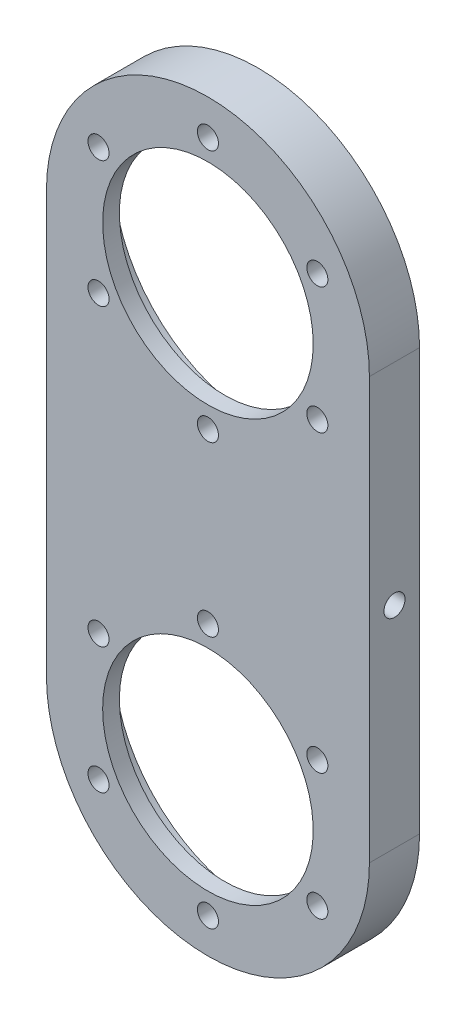
ISO-10303-21;
HEADER;
FILE_DESCRIPTION(('STEP AP214'),'2;1');
FILE_NAME('part.step','',(''),(''),'','','');
FILE_SCHEMA(('AUTOMOTIVE_DESIGN { 1 0 10303 214 1 1 1 1 }'));
ENDSEC;
DATA;
#1=APPLICATION_CONTEXT('core data for automotive mechanical design processes');
#2=APPLICATION_PROTOCOL_DEFINITION('international standard','automotive_design',2000,#1);
#3=PRODUCT_CONTEXT('',#1,'mechanical');
#4=PRODUCT('Part','Part','',(#3));
#5=PRODUCT_RELATED_PRODUCT_CATEGORY('part','',(#4));
#6=PRODUCT_DEFINITION_FORMATION('','',#4);
#7=PRODUCT_DEFINITION_CONTEXT('part definition',#1,'design');
#8=PRODUCT_DEFINITION('design','',#6,#7);
#9=PRODUCT_DEFINITION_SHAPE('','',#8);
#10=(LENGTH_UNIT() NAMED_UNIT(*) SI_UNIT(.MILLI.,.METRE.));
#11=(NAMED_UNIT(*) PLANE_ANGLE_UNIT() SI_UNIT($,.RADIAN.));
#12=(NAMED_UNIT(*) SI_UNIT($,.STERADIAN.) SOLID_ANGLE_UNIT());
#13=UNCERTAINTY_MEASURE_WITH_UNIT(LENGTH_MEASURE(1.E-05),#10,'distance_accuracy_value','');
#14=(GEOMETRIC_REPRESENTATION_CONTEXT(3) GLOBAL_UNCERTAINTY_ASSIGNED_CONTEXT((#13)) GLOBAL_UNIT_ASSIGNED_CONTEXT((#10,
#11,#12)) REPRESENTATION_CONTEXT('',''));
#15=CARTESIAN_POINT('',(0.,0.,0.));
#16=DIRECTION('',(0.,0.,1.));
#17=DIRECTION('',(1.,0.,0.));
#18=AXIS2_PLACEMENT_3D('',#15,#16,#17);
#19=CARTESIAN_POINT('',(0.,-40.,9.525));
#20=DIRECTION('',(0.,0.,-1.));
#21=DIRECTION('',(-1.,0.,0.));
#22=AXIS2_PLACEMENT_3D('',#19,#20,#21);
#23=CYLINDRICAL_SURFACE('',#22,27.5);
#24=CARTESIAN_POINT('',(0.,-40.,0.));
#25=DIRECTION('',(0.,0.,1.));
#26=DIRECTION('',(-1.,0.,0.));
#27=AXIS2_PLACEMENT_3D('',#24,#25,#26);
#28=CIRCLE('',#27,27.5);
#29=CARTESIAN_POINT('',(-27.5,-40.,0.));
#30=VERTEX_POINT('',#29);
#31=EDGE_CURVE('E122',#30,#30,#28,.T.);
#32=CARTESIAN_POINT('',(0.,-40.,6.35));
#33=DIRECTION('',(0.,0.,1.));
#34=DIRECTION('',(1.,0.,0.));
#35=AXIS2_PLACEMENT_3D('',#32,#33,#34);
#36=CIRCLE('',#35,27.5);
#37=CARTESIAN_POINT('',(-27.5,-40.,6.35));
#38=VERTEX_POINT('',#37);
#39=EDGE_CURVE('E137',#38,#38,#36,.T.);
#40=CARTESIAN_POINT('',(-27.5,-40.,0.));
#41=CARTESIAN_POINT('',(-27.5,-40.,0.0661458333333336));
#42=CARTESIAN_POINT('',(-27.5,-40.,0.132291666666667));
#43=CARTESIAN_POINT('',(-27.5,-40.,0.264583333333334));
#44=CARTESIAN_POINT('',(-27.5,-40.,0.330729166666667));
#45=CARTESIAN_POINT('',(-27.5,-40.,0.463020833333333));
#46=CARTESIAN_POINT('',(-27.5,-40.,0.529166666666667));
#47=CARTESIAN_POINT('',(-27.5,-40.,0.661458333333333));
#48=CARTESIAN_POINT('',(-27.5,-40.,0.727604166666666));
#49=CARTESIAN_POINT('',(-27.5,-40.,0.859895833333333));
#50=CARTESIAN_POINT('',(-27.5,-40.,0.926041666666666));
#51=CARTESIAN_POINT('',(-27.5,-40.,1.05833333333333));
#52=CARTESIAN_POINT('',(-27.5,-40.,1.12447916666667));
#53=CARTESIAN_POINT('',(-27.5,-40.,1.25677083333333));
#54=CARTESIAN_POINT('',(-27.5,-40.,1.32291666666667));
#55=CARTESIAN_POINT('',(-27.5,-40.,1.45520833333333));
#56=CARTESIAN_POINT('',(-27.5,-40.,1.52135416666667));
#57=CARTESIAN_POINT('',(-27.5,-40.,1.65364583333333));
#58=CARTESIAN_POINT('',(-27.5,-40.,1.71979166666667));
#59=CARTESIAN_POINT('',(-27.5,-40.,1.85208333333333));
#60=CARTESIAN_POINT('',(-27.5,-40.,1.91822916666667));
#61=CARTESIAN_POINT('',(-27.5,-40.,2.05052083333333));
#62=CARTESIAN_POINT('',(-27.5,-40.,2.11666666666667));
#63=CARTESIAN_POINT('',(-27.5,-40.,2.24895833333333));
#64=CARTESIAN_POINT('',(-27.5,-40.,2.31510416666667));
#65=CARTESIAN_POINT('',(-27.5,-40.,2.44739583333333));
#66=CARTESIAN_POINT('',(-27.5,-40.,2.51354166666667));
#67=CARTESIAN_POINT('',(-27.5,-40.,2.64583333333333));
#68=CARTESIAN_POINT('',(-27.5,-40.,2.71197916666667));
#69=CARTESIAN_POINT('',(-27.5,-40.,2.84427083333333));
#70=CARTESIAN_POINT('',(-27.5,-40.,2.91041666666667));
#71=CARTESIAN_POINT('',(-27.5,-40.,3.04270833333333));
#72=CARTESIAN_POINT('',(-27.5,-40.,3.10885416666667));
#73=CARTESIAN_POINT('',(-27.5,-40.,3.24114583333333));
#74=CARTESIAN_POINT('',(-27.5,-40.,3.30729166666667));
#75=CARTESIAN_POINT('',(-27.5,-40.,3.43958333333333));
#76=CARTESIAN_POINT('',(-27.5,-40.,3.50572916666667));
#77=CARTESIAN_POINT('',(-27.5,-40.,3.63802083333333));
#78=CARTESIAN_POINT('',(-27.5,-40.,3.70416666666667));
#79=CARTESIAN_POINT('',(-27.5,-40.,3.83645833333333));
#80=CARTESIAN_POINT('',(-27.5,-40.,3.90260416666667));
#81=CARTESIAN_POINT('',(-27.5,-40.,4.03489583333333));
#82=CARTESIAN_POINT('',(-27.5,-40.,4.10104166666667));
#83=CARTESIAN_POINT('',(-27.5,-40.,4.23333333333333));
#84=CARTESIAN_POINT('',(-27.5,-40.,4.29947916666667));
#85=CARTESIAN_POINT('',(-27.5,-40.,4.43177083333333));
#86=CARTESIAN_POINT('',(-27.5,-40.,4.49791666666667));
#87=CARTESIAN_POINT('',(-27.5,-40.,4.63020833333333));
#88=CARTESIAN_POINT('',(-27.5,-40.,4.69635416666667));
#89=CARTESIAN_POINT('',(-27.5,-40.,4.82864583333333));
#90=CARTESIAN_POINT('',(-27.5,-40.,4.89479166666667));
#91=CARTESIAN_POINT('',(-27.5,-40.,5.02708333333333));
#92=CARTESIAN_POINT('',(-27.5,-40.,5.09322916666667));
#93=CARTESIAN_POINT('',(-27.5,-40.,5.22552083333333));
#94=CARTESIAN_POINT('',(-27.5,-40.,5.29166666666667));
#95=CARTESIAN_POINT('',(-27.5,-40.,5.42395833333333));
#96=CARTESIAN_POINT('',(-27.5,-40.,5.49010416666667));
#97=CARTESIAN_POINT('',(-27.5,-40.,5.62239583333333));
#98=CARTESIAN_POINT('',(-27.5,-40.,5.68854166666667));
#99=CARTESIAN_POINT('',(-27.5,-40.,5.82083333333333));
#100=CARTESIAN_POINT('',(-27.5,-40.,5.88697916666667));
#101=CARTESIAN_POINT('',(-27.5,-40.,6.01927083333333));
#102=CARTESIAN_POINT('',(-27.5,-40.,6.08541666666667));
#103=CARTESIAN_POINT('',(-27.5,-40.,6.21770833333333));
#104=CARTESIAN_POINT('',(-27.5,-40.,6.28385416666667));
#105=CARTESIAN_POINT('',(-27.5,-40.,6.35));
#106=B_SPLINE_CURVE_WITH_KNOTS('',3,(#40,#41,#42,#43,#44,#45,#46,#47,#48,#49,#50,#51,#52,#53,
#54,#55,#56,#57,#58,#59,#60,#61,#62,#63,#64,#65,#66,#67,#68,#69,#70,#71,#72,#73,#74,#75,#76,#77,
#78,#79,#80,#81,#82,#83,#84,#85,#86,#87,#88,#89,#90,#91,#92,#93,#94,#95,#96,#97,#98,#99,#100,
#101,#102,#103,#104,#105),.UNSPECIFIED.,.F.,.F.,(4,2,2,2,2,2,2,2,2,2,2,2,2,2,2,2,2,2,2,2,2,2,2,
2,2,2,2,2,2,2,2,2,4),(0.,0.198437500000001,0.396875,0.5953125,0.793749999999999,0.9921875,
1.190625,1.3890625,1.5875,1.7859375,1.984375,2.1828125,2.38125,2.5796875,2.778125,2.9765625,
3.175,3.3734375,3.571875,3.7703125,3.96875,4.1671875,4.365625,4.5640625,4.7625,4.9609375,
5.159375,5.3578125,5.55625,5.7546875,5.953125,6.1515625,6.35),.UNSPECIFIED.);
#107=EDGE_CURVE('BSEAM47',#30,#38,#106,.T.);
#108=ORIENTED_EDGE('',*,*,#31,.F.);
#109=ORIENTED_EDGE('',*,*,#39,.T.);
#110=ORIENTED_EDGE('',*,*,#107,.T.);
#111=ORIENTED_EDGE('',*,*,#107,.F.);
#112=EDGE_LOOP('',(#108,#110,#109,#111));
#113=FACE_BOUND('',#112,.T.);
#114=ADVANCED_FACE('F47',(#113),#23,.F.);
#115=CARTESIAN_POINT('',(0.,40.,9.525));
#116=DIRECTION('',(0.,0.,-1.));
#117=DIRECTION('',(-1.,0.,0.));
#118=AXIS2_PLACEMENT_3D('',#115,#116,#117);
#119=CYLINDRICAL_SURFACE('',#118,27.5);
#120=CARTESIAN_POINT('',(0.,40.,0.));
#121=DIRECTION('',(0.,0.,1.));
#122=DIRECTION('',(1.,0.,0.));
#123=AXIS2_PLACEMENT_3D('',#120,#121,#122);
#124=CIRCLE('',#123,27.5);
#125=CARTESIAN_POINT('',(-27.5,40.,0.));
#126=VERTEX_POINT('',#125);
#127=EDGE_CURVE('E144',#126,#126,#124,.T.);
#128=CARTESIAN_POINT('',(0.,40.,6.35));
#129=DIRECTION('',(0.,0.,1.));
#130=DIRECTION('',(1.,0.,0.));
#131=AXIS2_PLACEMENT_3D('',#128,#129,#130);
#132=CIRCLE('',#131,27.5);
#133=CARTESIAN_POINT('',(-27.5,40.,6.35));
#134=VERTEX_POINT('',#133);
#135=EDGE_CURVE('E134',#134,#134,#132,.T.);
#136=CARTESIAN_POINT('',(-27.5,40.,0.));
#137=CARTESIAN_POINT('',(-27.5,40.,0.0661458333333336));
#138=CARTESIAN_POINT('',(-27.5,40.,0.132291666666667));
#139=CARTESIAN_POINT('',(-27.5,40.,0.264583333333334));
#140=CARTESIAN_POINT('',(-27.5,40.,0.330729166666667));
#141=CARTESIAN_POINT('',(-27.5,40.,0.463020833333333));
#142=CARTESIAN_POINT('',(-27.5,40.,0.529166666666667));
#143=CARTESIAN_POINT('',(-27.5,40.,0.661458333333333));
#144=CARTESIAN_POINT('',(-27.5,40.,0.727604166666666));
#145=CARTESIAN_POINT('',(-27.5,40.,0.859895833333333));
#146=CARTESIAN_POINT('',(-27.5,40.,0.926041666666666));
#147=CARTESIAN_POINT('',(-27.5,40.,1.05833333333333));
#148=CARTESIAN_POINT('',(-27.5,40.,1.12447916666667));
#149=CARTESIAN_POINT('',(-27.5,40.,1.25677083333333));
#150=CARTESIAN_POINT('',(-27.5,40.,1.32291666666667));
#151=CARTESIAN_POINT('',(-27.5,40.,1.45520833333333));
#152=CARTESIAN_POINT('',(-27.5,40.,1.52135416666667));
#153=CARTESIAN_POINT('',(-27.5,40.,1.65364583333333));
#154=CARTESIAN_POINT('',(-27.5,40.,1.71979166666667));
#155=CARTESIAN_POINT('',(-27.5,40.,1.85208333333333));
#156=CARTESIAN_POINT('',(-27.5,40.,1.91822916666667));
#157=CARTESIAN_POINT('',(-27.5,40.,2.05052083333333));
#158=CARTESIAN_POINT('',(-27.5,40.,2.11666666666667));
#159=CARTESIAN_POINT('',(-27.5,40.,2.24895833333333));
#160=CARTESIAN_POINT('',(-27.5,40.,2.31510416666667));
#161=CARTESIAN_POINT('',(-27.5,40.,2.44739583333333));
#162=CARTESIAN_POINT('',(-27.5,40.,2.51354166666667));
#163=CARTESIAN_POINT('',(-27.5,40.,2.64583333333333));
#164=CARTESIAN_POINT('',(-27.5,40.,2.71197916666667));
#165=CARTESIAN_POINT('',(-27.5,40.,2.84427083333333));
#166=CARTESIAN_POINT('',(-27.5,40.,2.91041666666667));
#167=CARTESIAN_POINT('',(-27.5,40.,3.04270833333333));
#168=CARTESIAN_POINT('',(-27.5,40.,3.10885416666667));
#169=CARTESIAN_POINT('',(-27.5,40.,3.24114583333333));
#170=CARTESIAN_POINT('',(-27.5,40.,3.30729166666667));
#171=CARTESIAN_POINT('',(-27.5,40.,3.43958333333333));
#172=CARTESIAN_POINT('',(-27.5,40.,3.50572916666667));
#173=CARTESIAN_POINT('',(-27.5,40.,3.63802083333333));
#174=CARTESIAN_POINT('',(-27.5,40.,3.70416666666667));
#175=CARTESIAN_POINT('',(-27.5,40.,3.83645833333333));
#176=CARTESIAN_POINT('',(-27.5,40.,3.90260416666667));
#177=CARTESIAN_POINT('',(-27.5,40.,4.03489583333333));
#178=CARTESIAN_POINT('',(-27.5,40.,4.10104166666667));
#179=CARTESIAN_POINT('',(-27.5,40.,4.23333333333333));
#180=CARTESIAN_POINT('',(-27.5,40.,4.29947916666667));
#181=CARTESIAN_POINT('',(-27.5,40.,4.43177083333333));
#182=CARTESIAN_POINT('',(-27.5,40.,4.49791666666667));
#183=CARTESIAN_POINT('',(-27.5,40.,4.63020833333333));
#184=CARTESIAN_POINT('',(-27.5,40.,4.69635416666667));
#185=CARTESIAN_POINT('',(-27.5,40.,4.82864583333333));
#186=CARTESIAN_POINT('',(-27.5,40.,4.89479166666667));
#187=CARTESIAN_POINT('',(-27.5,40.,5.02708333333333));
#188=CARTESIAN_POINT('',(-27.5,40.,5.09322916666667));
#189=CARTESIAN_POINT('',(-27.5,40.,5.22552083333333));
#190=CARTESIAN_POINT('',(-27.5,40.,5.29166666666667));
#191=CARTESIAN_POINT('',(-27.5,40.,5.42395833333333));
#192=CARTESIAN_POINT('',(-27.5,40.,5.49010416666667));
#193=CARTESIAN_POINT('',(-27.5,40.,5.62239583333333));
#194=CARTESIAN_POINT('',(-27.5,40.,5.68854166666667));
#195=CARTESIAN_POINT('',(-27.5,40.,5.82083333333333));
#196=CARTESIAN_POINT('',(-27.5,40.,5.88697916666667));
#197=CARTESIAN_POINT('',(-27.5,40.,6.01927083333333));
#198=CARTESIAN_POINT('',(-27.5,40.,6.08541666666667));
#199=CARTESIAN_POINT('',(-27.5,40.,6.21770833333333));
#200=CARTESIAN_POINT('',(-27.5,40.,6.28385416666667));
#201=CARTESIAN_POINT('',(-27.5,40.,6.35));
#202=B_SPLINE_CURVE_WITH_KNOTS('',3,(#136,#137,#138,#139,#140,#141,#142,#143,#144,#145,#146,
#147,#148,#149,#150,#151,#152,#153,#154,#155,#156,#157,#158,#159,#160,#161,#162,#163,#164,#165,
#166,#167,#168,#169,#170,#171,#172,#173,#174,#175,#176,#177,#178,#179,#180,#181,#182,#183,#184,
#185,#186,#187,#188,#189,#190,#191,#192,#193,#194,#195,#196,#197,#198,#199,#200,#201),
.UNSPECIFIED.,.F.,.F.,(4,2,2,2,2,2,2,2,2,2,2,2,2,2,2,2,2,2,2,2,2,2,2,2,2,2,2,2,2,2,2,2,4),(0.,
0.198437500000001,0.396875,0.5953125,0.793749999999999,0.9921875,1.190625,1.3890625,1.5875,
1.7859375,1.984375,2.1828125,2.38125,2.5796875,2.778125,2.9765625,3.175,3.3734375,3.571875,
3.7703125,3.96875,4.1671875,4.365625,4.5640625,4.7625,4.9609375,5.159375,5.3578125,5.55625,
5.7546875,5.953125,6.1515625,6.35),.UNSPECIFIED.);
#203=EDGE_CURVE('BSEAM172',#126,#134,#202,.T.);
#204=ORIENTED_EDGE('',*,*,#127,.F.);
#205=ORIENTED_EDGE('',*,*,#135,.T.);
#206=ORIENTED_EDGE('',*,*,#203,.T.);
#207=ORIENTED_EDGE('',*,*,#203,.F.);
#208=EDGE_LOOP('',(#204,#206,#205,#207));
#209=FACE_BOUND('',#208,.T.);
#210=ADVANCED_FACE('F172',(#209),#119,.F.);
#211=CARTESIAN_POINT('',(0.,40.,9.525));
#212=DIRECTION('',(0.,0.,1.));
#213=DIRECTION('',(1.,0.,0.));
#214=AXIS2_PLACEMENT_3D('',#211,#212,#213);
#215=PLANE('',#214);
#216=CARTESIAN_POINT('',(0.,40.,9.525));
#217=DIRECTION('',(0.,0.,1.));
#218=DIRECTION('',(1.,0.,0.));
#219=AXIS2_PLACEMENT_3D('',#216,#217,#218);
#220=CIRCLE('',#219,30.6750002325888);
#221=CARTESIAN_POINT('',(30.6750002325888,40.,9.525));
#222=VERTEX_POINT('',#221);
#223=CARTESIAN_POINT('',(-30.6750002325888,40.,9.525));
#224=VERTEX_POINT('',#223);
#225=EDGE_CURVE('E100',#222,#224,#220,.T.);
#226=ORIENTED_EDGE('',*,*,#225,.T.);
#227=DIRECTION('',(0.,-1.,0.));
#228=VECTOR('',#227,1.);
#229=CARTESIAN_POINT('',(-30.6750002325888,40.,9.525));
#230=LINE('',#229,#228);
#231=CARTESIAN_POINT('',(-30.6750002325888,-40.,9.525));
#232=VERTEX_POINT('',#231);
#233=EDGE_CURVE('E95',#224,#232,#230,.T.);
#234=ORIENTED_EDGE('',*,*,#233,.T.);
#235=CARTESIAN_POINT('',(0.,-40.,9.525));
#236=DIRECTION('',(0.,0.,1.));
#237=DIRECTION('',(1.,0.,0.));
#238=AXIS2_PLACEMENT_3D('',#235,#236,#237);
#239=CIRCLE('',#238,30.6750002325888);
#240=CARTESIAN_POINT('',(30.6750002325888,-40.,9.525));
#241=VERTEX_POINT('',#240);
#242=EDGE_CURVE('E99',#232,#241,#239,.T.);
#243=ORIENTED_EDGE('',*,*,#242,.T.);
#244=DIRECTION('',(0.,1.,0.));
#245=VECTOR('',#244,1.);
#246=CARTESIAN_POINT('',(30.6750002325888,-40.,9.525));
#247=LINE('',#246,#245);
#248=EDGE_CURVE('E67',#241,#222,#247,.T.);
#249=ORIENTED_EDGE('',*,*,#248,.T.);
#250=EDGE_LOOP('',(#226,#234,#243,#249));
#251=FACE_BOUND('',#250,.T.);
#252=CARTESIAN_POINT('',(0.,40.,9.525));
#253=DIRECTION('',(0.,0.,1.));
#254=DIRECTION('',(1.,0.,0.));
#255=AXIS2_PLACEMENT_3D('',#252,#253,#254);
#256=CIRCLE('',#255,20.);
#257=CARTESIAN_POINT('',(20.,40.,9.525));
#258=VERTEX_POINT('',#257);
#259=EDGE_CURVE('E147',#258,#258,#256,.T.);
#260=ORIENTED_EDGE('',*,*,#259,.F.);
#261=EDGE_LOOP('',(#260));
#262=FACE_BOUND('',#261,.T.);
#263=CARTESIAN_POINT('',(0.,64.,9.525));
#264=DIRECTION('',(0.,0.,1.));
#265=DIRECTION('',(1.,0.,0.));
#266=AXIS2_PLACEMENT_3D('',#263,#264,#265);
#267=CIRCLE('',#266,2.00000000000001);
#268=CARTESIAN_POINT('',(2.00000000000001,64.,9.525));
#269=VERTEX_POINT('',#268);
#270=EDGE_CURVE('E156',#269,#269,#267,.T.);
#271=ORIENTED_EDGE('',*,*,#270,.F.);
#272=EDGE_LOOP('',(#271));
#273=FACE_BOUND('',#272,.T.);
#274=CARTESIAN_POINT('',(20.7846096908265,52.,9.525));
#275=DIRECTION('',(0.,0.,1.));
#276=DIRECTION('',(1.,0.,0.));
#277=AXIS2_PLACEMENT_3D('',#274,#275,#276);
#278=CIRCLE('',#277,2.);
#279=CARTESIAN_POINT('',(22.7846096908265,52.,9.525));
#280=VERTEX_POINT('',#279);
#281=EDGE_CURVE('E254',#280,#280,#278,.T.);
#282=ORIENTED_EDGE('',*,*,#281,.F.);
#283=EDGE_LOOP('',(#282));
#284=FACE_BOUND('',#283,.T.);
#285=CARTESIAN_POINT('',(20.7846096908266,28.,9.525));
#286=DIRECTION('',(0.,0.,1.));
#287=DIRECTION('',(1.,0.,0.));
#288=AXIS2_PLACEMENT_3D('',#285,#286,#287);
#289=CIRCLE('',#288,2.);
#290=CARTESIAN_POINT('',(22.7846096908265,28.,9.525));
#291=VERTEX_POINT('',#290);
#292=EDGE_CURVE('E248',#291,#291,#289,.T.);
#293=ORIENTED_EDGE('',*,*,#292,.F.);
#294=EDGE_LOOP('',(#293));
#295=FACE_BOUND('',#294,.T.);
#296=CARTESIAN_POINT('',(0.,16.,9.525));
#297=DIRECTION('',(0.,0.,1.));
#298=DIRECTION('',(1.,0.,0.));
#299=AXIS2_PLACEMENT_3D('',#296,#297,#298);
#300=CIRCLE('',#299,2.);
#301=CARTESIAN_POINT('',(2.00000000000003,16.,9.525));
#302=VERTEX_POINT('',#301);
#303=EDGE_CURVE('E244',#302,#302,#300,.T.);
#304=ORIENTED_EDGE('',*,*,#303,.F.);
#305=EDGE_LOOP('',(#304));
#306=FACE_BOUND('',#305,.T.);
#307=CARTESIAN_POINT('',(-20.7846096908265,28.,9.525));
#308=DIRECTION('',(0.,0.,1.));
#309=DIRECTION('',(1.,0.,0.));
#310=AXIS2_PLACEMENT_3D('',#307,#308,#309);
#311=CIRCLE('',#310,2.00000000000001);
#312=CARTESIAN_POINT('',(-18.7846096908265,28.,9.525));
#313=VERTEX_POINT('',#312);
#314=EDGE_CURVE('E229',#313,#313,#311,.T.);
#315=ORIENTED_EDGE('',*,*,#314,.F.);
#316=EDGE_LOOP('',(#315));
#317=FACE_BOUND('',#316,.T.);
#318=CARTESIAN_POINT('',(-20.7846096908265,52.,9.525));
#319=DIRECTION('',(0.,0.,1.));
#320=DIRECTION('',(1.,0.,0.));
#321=AXIS2_PLACEMENT_3D('',#318,#319,#320);
#322=CIRCLE('',#321,2.00000000000001);
#323=CARTESIAN_POINT('',(-18.7846096908265,52.,9.525));
#324=VERTEX_POINT('',#323);
#325=EDGE_CURVE('E230',#324,#324,#322,.T.);
#326=ORIENTED_EDGE('',*,*,#325,.F.);
#327=EDGE_LOOP('',(#326));
#328=FACE_BOUND('',#327,.T.);
#329=CARTESIAN_POINT('',(-20.7846096908265,-52.,9.525));
#330=DIRECTION('',(0.,0.,1.));
#331=DIRECTION('',(-1.,0.,0.));
#332=AXIS2_PLACEMENT_3D('',#329,#330,#331);
#333=CIRCLE('',#332,2.00000000000001);
#334=CARTESIAN_POINT('',(-22.7846096908265,-52.,9.525));
#335=VERTEX_POINT('',#334);
#336=EDGE_CURVE('E260',#335,#335,#333,.T.);
#337=ORIENTED_EDGE('',*,*,#336,.F.);
#338=EDGE_LOOP('',(#337));
#339=FACE_BOUND('',#338,.T.);
#340=CARTESIAN_POINT('',(-20.7846096908265,-28.,9.525));
#341=DIRECTION('',(0.,0.,1.));
#342=DIRECTION('',(-1.,0.,0.));
#343=AXIS2_PLACEMENT_3D('',#340,#341,#342);
#344=CIRCLE('',#343,2.00000000000001);
#345=CARTESIAN_POINT('',(-22.7846096908265,-28.,9.525));
#346=VERTEX_POINT('',#345);
#347=EDGE_CURVE('E240',#346,#346,#344,.T.);
#348=ORIENTED_EDGE('',*,*,#347,.F.);
#349=EDGE_LOOP('',(#348));
#350=FACE_BOUND('',#349,.T.);
#351=CARTESIAN_POINT('',(0.,-16.,9.525));
#352=DIRECTION('',(0.,0.,1.));
#353=DIRECTION('',(-1.,0.,0.));
#354=AXIS2_PLACEMENT_3D('',#351,#352,#353);
#355=CIRCLE('',#354,2.);
#356=CARTESIAN_POINT('',(-1.99999999999997,-16.,9.525));
#357=VERTEX_POINT('',#356);
#358=EDGE_CURVE('E296',#357,#357,#355,.T.);
#359=ORIENTED_EDGE('',*,*,#358,.F.);
#360=EDGE_LOOP('',(#359));
#361=FACE_BOUND('',#360,.T.);
#362=CARTESIAN_POINT('',(20.7846096908266,-28.,9.525));
#363=DIRECTION('',(0.,0.,1.));
#364=DIRECTION('',(-1.,0.,0.));
#365=AXIS2_PLACEMENT_3D('',#362,#363,#364);
#366=CIRCLE('',#365,2.00000000000001);
#367=CARTESIAN_POINT('',(18.7846096908265,-28.,9.525));
#368=VERTEX_POINT('',#367);
#369=EDGE_CURVE('E300',#368,#368,#366,.T.);
#370=ORIENTED_EDGE('',*,*,#369,.F.);
#371=EDGE_LOOP('',(#370));
#372=FACE_BOUND('',#371,.T.);
#373=CARTESIAN_POINT('',(20.7846096908265,-52.,9.525));
#374=DIRECTION('',(0.,0.,1.));
#375=DIRECTION('',(-1.,0.,0.));
#376=AXIS2_PLACEMENT_3D('',#373,#374,#375);
#377=CIRCLE('',#376,2.);
#378=CARTESIAN_POINT('',(18.7846096908265,-52.,9.525));
#379=VERTEX_POINT('',#378);
#380=EDGE_CURVE('E304',#379,#379,#377,.T.);
#381=ORIENTED_EDGE('',*,*,#380,.F.);
#382=EDGE_LOOP('',(#381));
#383=FACE_BOUND('',#382,.T.);
#384=CARTESIAN_POINT('',(0.,-64.,9.525));
#385=DIRECTION('',(0.,0.,1.));
#386=DIRECTION('',(-1.,0.,0.));
#387=AXIS2_PLACEMENT_3D('',#384,#385,#386);
#388=CIRCLE('',#387,2.);
#389=CARTESIAN_POINT('',(-2.,-64.,9.525));
#390=VERTEX_POINT('',#389);
#391=EDGE_CURVE('E308',#390,#390,#388,.T.);
#392=ORIENTED_EDGE('',*,*,#391,.F.);
#393=EDGE_LOOP('',(#392));
#394=FACE_BOUND('',#393,.T.);
#395=CARTESIAN_POINT('',(0.,-40.,9.525));
#396=DIRECTION('',(0.,0.,1.));
#397=DIRECTION('',(-1.,0.,0.));
#398=AXIS2_PLACEMENT_3D('',#395,#396,#397);
#399=CIRCLE('',#398,20.);
#400=CARTESIAN_POINT('',(-20.,-40.,9.525));
#401=VERTEX_POINT('',#400);
#402=EDGE_CURVE('E311',#401,#401,#399,.T.);
#403=ORIENTED_EDGE('',*,*,#402,.F.);
#404=EDGE_LOOP('',(#403));
#405=FACE_BOUND('',#404,.T.);
#406=ADVANCED_FACE('F96',(#251,#262,#273,#284,#295,#306,#317,#328,#339,#350,#361,#372,#383,#394,
#405),#215,.T.);
#407=CARTESIAN_POINT('',(0.,40.,0.));
#408=DIRECTION('',(0.,0.,1.));
#409=DIRECTION('',(1.,0.,0.));
#410=AXIS2_PLACEMENT_3D('',#407,#408,#409);
#411=PLANE('',#410);
#412=CARTESIAN_POINT('',(0.,40.,0.));
#413=DIRECTION('',(0.,0.,1.));
#414=DIRECTION('',(1.,0.,0.));
#415=AXIS2_PLACEMENT_3D('',#412,#413,#414);
#416=CIRCLE('',#415,30.6750002325888);
#417=CARTESIAN_POINT('',(30.6750002325888,40.,0.));
#418=VERTEX_POINT('',#417);
#419=CARTESIAN_POINT('',(-30.6750002325888,40.,0.));
#420=VERTEX_POINT('',#419);
#421=EDGE_CURVE('E119',#418,#420,#416,.T.);
#422=ORIENTED_EDGE('',*,*,#421,.F.);
#423=DIRECTION('',(0.,1.,0.));
#424=VECTOR('',#423,1.);
#425=CARTESIAN_POINT('',(30.6750002325888,-40.,0.));
#426=LINE('',#425,#424);
#427=CARTESIAN_POINT('',(30.6750002325888,-40.,0.));
#428=VERTEX_POINT('',#427);
#429=EDGE_CURVE('E128',#428,#418,#426,.T.);
#430=ORIENTED_EDGE('',*,*,#429,.F.);
#431=CARTESIAN_POINT('',(0.,-40.,0.));
#432=DIRECTION('',(0.,0.,1.));
#433=DIRECTION('',(1.,0.,0.));
#434=AXIS2_PLACEMENT_3D('',#431,#432,#433);
#435=CIRCLE('',#434,30.6750002325888);
#436=CARTESIAN_POINT('',(-30.6750002325888,-40.,0.));
#437=VERTEX_POINT('',#436);
#438=EDGE_CURVE('E125',#437,#428,#435,.T.);
#439=ORIENTED_EDGE('',*,*,#438,.F.);
#440=DIRECTION('',(0.,-1.,0.));
#441=VECTOR('',#440,1.);
#442=CARTESIAN_POINT('',(-30.6750002325888,40.,0.));
#443=LINE('',#442,#441);
#444=EDGE_CURVE('E107',#420,#437,#443,.T.);
#445=ORIENTED_EDGE('',*,*,#444,.F.);
#446=EDGE_LOOP('',(#422,#430,#439,#445));
#447=FACE_BOUND('',#446,.T.);
#448=ORIENTED_EDGE('',*,*,#31,.T.);
#449=EDGE_LOOP('',(#448));
#450=FACE_BOUND('',#449,.T.);
#451=ORIENTED_EDGE('',*,*,#127,.T.);
#452=EDGE_LOOP('',(#451));
#453=FACE_BOUND('',#452,.T.);
#454=ADVANCED_FACE('F167',(#447,#450,#453),#411,.F.);
#455=CARTESIAN_POINT('',(0.,40.,9.525));
#456=DIRECTION('',(0.,0.,-1.));
#457=DIRECTION('',(-1.,0.,0.));
#458=AXIS2_PLACEMENT_3D('',#455,#456,#457);
#459=CYLINDRICAL_SURFACE('',#458,30.6750002325888);
#460=DIRECTION('',(0.,0.,-1.));
#461=VECTOR('',#460,1.);
#462=CARTESIAN_POINT('',(30.6750002325888,40.,9.525));
#463=LINE('',#462,#461);
#464=EDGE_CURVE('E89',#222,#418,#463,.T.);
#465=ORIENTED_EDGE('',*,*,#464,.T.);
#466=ORIENTED_EDGE('',*,*,#421,.T.);
#467=DIRECTION('',(0.,0.,-1.));
#468=VECTOR('',#467,1.);
#469=CARTESIAN_POINT('',(-30.6750002325888,40.,9.525));
#470=LINE('',#469,#468);
#471=EDGE_CURVE('E11',#224,#420,#470,.T.);
#472=ORIENTED_EDGE('',*,*,#471,.F.);
#473=ORIENTED_EDGE('',*,*,#225,.F.);
#474=EDGE_LOOP('',(#465,#466,#472,#473));
#475=FACE_BOUND('',#474,.T.);
#476=ADVANCED_FACE('F49',(#475),#459,.T.);
#477=CARTESIAN_POINT('',(-30.6750002325888,40.,9.525));
#478=DIRECTION('',(1.,0.,0.));
#479=DIRECTION('',(0.,1.,0.));
#480=AXIS2_PLACEMENT_3D('',#477,#478,#479);
#481=PLANE('',#480);
#482=CARTESIAN_POINT('',(-30.6750002325888,0.,4.7625));
#483=DIRECTION('',(1.,0.,0.));
#484=DIRECTION('',(0.,1.,0.));
#485=AXIS2_PLACEMENT_3D('',#482,#483,#484);
#486=CIRCLE('',#485,2.);
#487=CARTESIAN_POINT('',(-30.6750002325888,0.,2.7625));
#488=VERTEX_POINT('',#487);
#489=EDGE_CURVE('E315',#488,#488,#486,.T.);
#490=ORIENTED_EDGE('',*,*,#489,.T.);
#491=EDGE_LOOP('',(#490));
#492=FACE_BOUND('',#491,.T.);
#493=ORIENTED_EDGE('',*,*,#471,.T.);
#494=ORIENTED_EDGE('',*,*,#444,.T.);
#495=DIRECTION('',(0.,0.,-1.));
#496=VECTOR('',#495,1.);
#497=CARTESIAN_POINT('',(-30.6750002325888,-40.,9.525));
#498=LINE('',#497,#496);
#499=EDGE_CURVE('E58',#232,#437,#498,.T.);
#500=ORIENTED_EDGE('',*,*,#499,.F.);
#501=ORIENTED_EDGE('',*,*,#233,.F.);
#502=EDGE_LOOP('',(#493,#494,#500,#501));
#503=FACE_BOUND('',#502,.T.);
#504=ADVANCED_FACE('F105',(#492,#503),#481,.F.);
#505=CARTESIAN_POINT('',(0.,-40.,9.525));
#506=DIRECTION('',(0.,0.,-1.));
#507=DIRECTION('',(-1.,0.,0.));
#508=AXIS2_PLACEMENT_3D('',#505,#506,#507);
#509=CYLINDRICAL_SURFACE('',#508,30.6750002325888);
#510=ORIENTED_EDGE('',*,*,#499,.T.);
#511=ORIENTED_EDGE('',*,*,#438,.T.);
#512=DIRECTION('',(0.,0.,-1.));
#513=VECTOR('',#512,1.);
#514=CARTESIAN_POINT('',(30.6750002325888,-40.,9.525));
#515=LINE('',#514,#513);
#516=EDGE_CURVE('E82',#241,#428,#515,.T.);
#517=ORIENTED_EDGE('',*,*,#516,.F.);
#518=ORIENTED_EDGE('',*,*,#242,.F.);
#519=EDGE_LOOP('',(#510,#511,#517,#518));
#520=FACE_BOUND('',#519,.T.);
#521=ADVANCED_FACE('F112',(#520),#509,.T.);
#522=CARTESIAN_POINT('',(30.6750002325888,-40.,9.525));
#523=DIRECTION('',(-1.,0.,0.));
#524=DIRECTION('',(0.,0.,1.));
#525=AXIS2_PLACEMENT_3D('',#522,#523,#524);
#526=PLANE('',#525);
#527=CARTESIAN_POINT('',(30.6750002325888,0.,4.7625));
#528=DIRECTION('',(-1.,0.,0.));
#529=DIRECTION('',(0.,0.,1.));
#530=AXIS2_PLACEMENT_3D('',#527,#528,#529);
#531=CIRCLE('',#530,2.);
#532=CARTESIAN_POINT('',(30.6750002325889,0.,2.7625));
#533=VERTEX_POINT('',#532);
#534=EDGE_CURVE('E51',#533,#533,#531,.T.);
#535=ORIENTED_EDGE('',*,*,#534,.T.);
#536=EDGE_LOOP('',(#535));
#537=FACE_BOUND('',#536,.T.);
#538=ORIENTED_EDGE('',*,*,#516,.T.);
#539=ORIENTED_EDGE('',*,*,#429,.T.);
#540=ORIENTED_EDGE('',*,*,#464,.F.);
#541=ORIENTED_EDGE('',*,*,#248,.F.);
#542=EDGE_LOOP('',(#538,#539,#540,#541));
#543=FACE_BOUND('',#542,.T.);
#544=ADVANCED_FACE('F368',(#537,#543),#526,.F.);
#545=CARTESIAN_POINT('',(-20.7846096908265,52.,6.35));
#546=DIRECTION('',(0.,0.,1.));
#547=DIRECTION('',(1.,0.,0.));
#548=AXIS2_PLACEMENT_3D('',#545,#546,#547);
#549=CYLINDRICAL_SURFACE('',#548,2.00000000000001);
#550=CARTESIAN_POINT('',(-20.7846096908265,52.,6.35));
#551=DIRECTION('',(0.,0.,1.));
#552=DIRECTION('',(1.,0.,0.));
#553=AXIS2_PLACEMENT_3D('',#550,#551,#552);
#554=CIRCLE('',#553,2.00000000000001);
#555=CARTESIAN_POINT('',(-18.7846096908265,52.,6.35));
#556=VERTEX_POINT('',#555);
#557=EDGE_CURVE('E226',#556,#556,#554,.T.);
#558=ORIENTED_EDGE('',*,*,#557,.F.);
#559=EDGE_LOOP('',(#558));
#560=FACE_BOUND('',#559,.T.);
#561=ORIENTED_EDGE('',*,*,#325,.T.);
#562=EDGE_LOOP('',(#561));
#563=FACE_BOUND('',#562,.T.);
#564=ADVANCED_FACE('F364',(#560,#563),#549,.F.);
#565=CARTESIAN_POINT('',(-20.7846096908265,28.,6.35));
#566=DIRECTION('',(0.,0.,1.));
#567=DIRECTION('',(1.,0.,0.));
#568=AXIS2_PLACEMENT_3D('',#565,#566,#567);
#569=CYLINDRICAL_SURFACE('',#568,2.00000000000001);
#570=CARTESIAN_POINT('',(-20.7846096908265,28.,6.35));
#571=DIRECTION('',(0.,0.,1.));
#572=DIRECTION('',(1.,0.,0.));
#573=AXIS2_PLACEMENT_3D('',#570,#571,#572);
#574=CIRCLE('',#573,2.00000000000001);
#575=CARTESIAN_POINT('',(-18.7846096908265,28.,6.35));
#576=VERTEX_POINT('',#575);
#577=EDGE_CURVE('E222',#576,#576,#574,.T.);
#578=ORIENTED_EDGE('',*,*,#577,.F.);
#579=EDGE_LOOP('',(#578));
#580=FACE_BOUND('',#579,.T.);
#581=ORIENTED_EDGE('',*,*,#314,.T.);
#582=EDGE_LOOP('',(#581));
#583=FACE_BOUND('',#582,.T.);
#584=ADVANCED_FACE('F367',(#580,#583),#569,.F.);
#585=CARTESIAN_POINT('',(0.,16.,6.35));
#586=DIRECTION('',(0.,0.,1.));
#587=DIRECTION('',(1.,0.,0.));
#588=AXIS2_PLACEMENT_3D('',#585,#586,#587);
#589=CYLINDRICAL_SURFACE('',#588,2.);
#590=CARTESIAN_POINT('',(0.,16.,6.35));
#591=DIRECTION('',(0.,0.,1.));
#592=DIRECTION('',(1.,0.,0.));
#593=AXIS2_PLACEMENT_3D('',#590,#591,#592);
#594=CIRCLE('',#593,2.);
#595=CARTESIAN_POINT('',(2.00000000000003,16.,6.35));
#596=VERTEX_POINT('',#595);
#597=EDGE_CURVE('E218',#596,#596,#594,.T.);
#598=ORIENTED_EDGE('',*,*,#597,.F.);
#599=EDGE_LOOP('',(#598));
#600=FACE_BOUND('',#599,.T.);
#601=ORIENTED_EDGE('',*,*,#303,.T.);
#602=EDGE_LOOP('',(#601));
#603=FACE_BOUND('',#602,.T.);
#604=ADVANCED_FACE('F371',(#600,#603),#589,.F.);
#605=CARTESIAN_POINT('',(20.7846096908266,28.,6.35));
#606=DIRECTION('',(0.,0.,1.));
#607=DIRECTION('',(1.,0.,0.));
#608=AXIS2_PLACEMENT_3D('',#605,#606,#607);
#609=CYLINDRICAL_SURFACE('',#608,2.);
#610=CARTESIAN_POINT('',(20.7846096908266,28.,6.35));
#611=DIRECTION('',(0.,0.,1.));
#612=DIRECTION('',(1.,0.,0.));
#613=AXIS2_PLACEMENT_3D('',#610,#611,#612);
#614=CIRCLE('',#613,2.);
#615=CARTESIAN_POINT('',(22.7846096908265,28.,6.35));
#616=VERTEX_POINT('',#615);
#617=EDGE_CURVE('E214',#616,#616,#614,.T.);
#618=ORIENTED_EDGE('',*,*,#617,.F.);
#619=EDGE_LOOP('',(#618));
#620=FACE_BOUND('',#619,.T.);
#621=ORIENTED_EDGE('',*,*,#292,.T.);
#622=EDGE_LOOP('',(#621));
#623=FACE_BOUND('',#622,.T.);
#624=ADVANCED_FACE('F375',(#620,#623),#609,.F.);
#625=CARTESIAN_POINT('',(20.7846096908265,52.,6.35));
#626=DIRECTION('',(0.,0.,1.));
#627=DIRECTION('',(1.,0.,0.));
#628=AXIS2_PLACEMENT_3D('',#625,#626,#627);
#629=CYLINDRICAL_SURFACE('',#628,2.);
#630=CARTESIAN_POINT('',(20.7846096908265,52.,6.35));
#631=DIRECTION('',(0.,0.,1.));
#632=DIRECTION('',(1.,0.,0.));
#633=AXIS2_PLACEMENT_3D('',#630,#631,#632);
#634=CIRCLE('',#633,2.);
#635=CARTESIAN_POINT('',(22.7846096908265,52.,6.35));
#636=VERTEX_POINT('',#635);
#637=EDGE_CURVE('E210',#636,#636,#634,.T.);
#638=ORIENTED_EDGE('',*,*,#637,.F.);
#639=EDGE_LOOP('',(#638));
#640=FACE_BOUND('',#639,.T.);
#641=ORIENTED_EDGE('',*,*,#281,.T.);
#642=EDGE_LOOP('',(#641));
#643=FACE_BOUND('',#642,.T.);
#644=ADVANCED_FACE('F200',(#640,#643),#629,.F.);
#645=CARTESIAN_POINT('',(0.,64.,6.35));
#646=DIRECTION('',(0.,0.,1.));
#647=DIRECTION('',(1.,0.,0.));
#648=AXIS2_PLACEMENT_3D('',#645,#646,#647);
#649=CYLINDRICAL_SURFACE('',#648,2.00000000000001);
#650=CARTESIAN_POINT('',(0.,64.,6.35));
#651=DIRECTION('',(0.,0.,1.));
#652=DIRECTION('',(1.,0.,0.));
#653=AXIS2_PLACEMENT_3D('',#650,#651,#652);
#654=CIRCLE('',#653,2.00000000000001);
#655=CARTESIAN_POINT('',(2.00000000000001,64.,6.35));
#656=VERTEX_POINT('',#655);
#657=EDGE_CURVE('E153',#656,#656,#654,.T.);
#658=ORIENTED_EDGE('',*,*,#657,.F.);
#659=EDGE_LOOP('',(#658));
#660=FACE_BOUND('',#659,.T.);
#661=ORIENTED_EDGE('',*,*,#270,.T.);
#662=EDGE_LOOP('',(#661));
#663=FACE_BOUND('',#662,.T.);
#664=ADVANCED_FACE('F196',(#660,#663),#649,.F.);
#665=CARTESIAN_POINT('',(0.,-40.,6.35));
#666=DIRECTION('',(0.,0.,1.));
#667=DIRECTION('',(1.,0.,0.));
#668=AXIS2_PLACEMENT_3D('',#665,#666,#667);
#669=PLANE('',#668);
#670=CARTESIAN_POINT('',(0.,40.,6.35));
#671=DIRECTION('',(0.,0.,1.));
#672=DIRECTION('',(1.,0.,0.));
#673=AXIS2_PLACEMENT_3D('',#670,#671,#672);
#674=CIRCLE('',#673,20.);
#675=CARTESIAN_POINT('',(20.,40.,6.35));
#676=VERTEX_POINT('',#675);
#677=EDGE_CURVE('E138',#676,#676,#674,.T.);
#678=ORIENTED_EDGE('',*,*,#677,.T.);
#679=EDGE_LOOP('',(#678));
#680=FACE_BOUND('',#679,.T.);
#681=ORIENTED_EDGE('',*,*,#657,.T.);
#682=EDGE_LOOP('',(#681));
#683=FACE_BOUND('',#682,.T.);
#684=ORIENTED_EDGE('',*,*,#637,.T.);
#685=EDGE_LOOP('',(#684));
#686=FACE_BOUND('',#685,.T.);
#687=ORIENTED_EDGE('',*,*,#617,.T.);
#688=EDGE_LOOP('',(#687));
#689=FACE_BOUND('',#688,.T.);
#690=ORIENTED_EDGE('',*,*,#597,.T.);
#691=EDGE_LOOP('',(#690));
#692=FACE_BOUND('',#691,.T.);
#693=ORIENTED_EDGE('',*,*,#577,.T.);
#694=EDGE_LOOP('',(#693));
#695=FACE_BOUND('',#694,.T.);
#696=ORIENTED_EDGE('',*,*,#557,.T.);
#697=EDGE_LOOP('',(#696));
#698=FACE_BOUND('',#697,.T.);
#699=ORIENTED_EDGE('',*,*,#135,.F.);
#700=EDGE_LOOP('',(#699));
#701=FACE_BOUND('',#700,.T.);
#702=ADVANCED_FACE('F182',(#680,#683,#686,#689,#692,#695,#698,#701),#669,.F.);
#703=CARTESIAN_POINT('',(0.,40.,6.35));
#704=DIRECTION('',(0.,0.,1.));
#705=DIRECTION('',(1.,0.,0.));
#706=AXIS2_PLACEMENT_3D('',#703,#704,#705);
#707=CYLINDRICAL_SURFACE('',#706,20.);
#708=ORIENTED_EDGE('',*,*,#677,.F.);
#709=EDGE_LOOP('',(#708));
#710=FACE_BOUND('',#709,.T.);
#711=ORIENTED_EDGE('',*,*,#259,.T.);
#712=EDGE_LOOP('',(#711));
#713=FACE_BOUND('',#712,.T.);
#714=ADVANCED_FACE('F179',(#710,#713),#707,.F.);
#715=CARTESIAN_POINT('',(-20.7846096908265,-52.,6.35));
#716=DIRECTION('',(0.,0.,1.));
#717=DIRECTION('',(-1.,0.,0.));
#718=AXIS2_PLACEMENT_3D('',#715,#716,#717);
#719=CIRCLE('',#718,2.00000000000001);
#720=CARTESIAN_POINT('',(-22.7846096908265,-52.,6.35));
#721=VERTEX_POINT('',#720);
#722=EDGE_CURVE('E264',#721,#721,#719,.T.);
#723=ORIENTED_EDGE('',*,*,#722,.T.);
#724=EDGE_LOOP('',(#723));
#725=FACE_BOUND('',#724,.T.);
#726=CARTESIAN_POINT('',(-20.7846096908265,-28.,6.35));
#727=DIRECTION('',(0.,0.,1.));
#728=DIRECTION('',(-1.,0.,0.));
#729=AXIS2_PLACEMENT_3D('',#726,#727,#728);
#730=CIRCLE('',#729,2.00000000000001);
#731=CARTESIAN_POINT('',(-22.7846096908265,-28.,6.35));
#732=VERTEX_POINT('',#731);
#733=EDGE_CURVE('E237',#732,#732,#730,.T.);
#734=ORIENTED_EDGE('',*,*,#733,.T.);
#735=EDGE_LOOP('',(#734));
#736=FACE_BOUND('',#735,.T.);
#737=CARTESIAN_POINT('',(0.,-16.,6.35));
#738=DIRECTION('',(0.,0.,1.));
#739=DIRECTION('',(-1.,0.,0.));
#740=AXIS2_PLACEMENT_3D('',#737,#738,#739);
#741=CIRCLE('',#740,2.);
#742=CARTESIAN_POINT('',(-1.99999999999997,-16.,6.35));
#743=VERTEX_POINT('',#742);
#744=EDGE_CURVE('E342',#743,#743,#741,.T.);
#745=ORIENTED_EDGE('',*,*,#744,.T.);
#746=EDGE_LOOP('',(#745));
#747=FACE_BOUND('',#746,.T.);
#748=CARTESIAN_POINT('',(20.7846096908266,-28.,6.35));
#749=DIRECTION('',(0.,0.,1.));
#750=DIRECTION('',(-1.,0.,0.));
#751=AXIS2_PLACEMENT_3D('',#748,#749,#750);
#752=CIRCLE('',#751,2.00000000000001);
#753=CARTESIAN_POINT('',(18.7846096908265,-28.,6.35));
#754=VERTEX_POINT('',#753);
#755=EDGE_CURVE('E336',#754,#754,#752,.T.);
#756=ORIENTED_EDGE('',*,*,#755,.T.);
#757=EDGE_LOOP('',(#756));
#758=FACE_BOUND('',#757,.T.);
#759=CARTESIAN_POINT('',(20.7846096908265,-52.,6.35));
#760=DIRECTION('',(0.,0.,1.));
#761=DIRECTION('',(-1.,0.,0.));
#762=AXIS2_PLACEMENT_3D('',#759,#760,#761);
#763=CIRCLE('',#762,2.);
#764=CARTESIAN_POINT('',(18.7846096908265,-52.,6.35));
#765=VERTEX_POINT('',#764);
#766=EDGE_CURVE('E330',#765,#765,#763,.T.);
#767=ORIENTED_EDGE('',*,*,#766,.T.);
#768=EDGE_LOOP('',(#767));
#769=FACE_BOUND('',#768,.T.);
#770=CARTESIAN_POINT('',(0.,-64.,6.35));
#771=DIRECTION('',(0.,0.,1.));
#772=DIRECTION('',(-1.,0.,0.));
#773=AXIS2_PLACEMENT_3D('',#770,#771,#772);
#774=CIRCLE('',#773,2.);
#775=CARTESIAN_POINT('',(-2.,-64.,6.35));
#776=VERTEX_POINT('',#775);
#777=EDGE_CURVE('E324',#776,#776,#774,.T.);
#778=ORIENTED_EDGE('',*,*,#777,.T.);
#779=EDGE_LOOP('',(#778));
#780=FACE_BOUND('',#779,.T.);
#781=CARTESIAN_POINT('',(0.,-40.,6.35));
#782=DIRECTION('',(0.,0.,1.));
#783=DIRECTION('',(-1.,0.,0.));
#784=AXIS2_PLACEMENT_3D('',#781,#782,#783);
#785=CIRCLE('',#784,20.);
#786=CARTESIAN_POINT('',(-20.,-40.,6.35));
#787=VERTEX_POINT('',#786);
#788=EDGE_CURVE('E314',#787,#787,#785,.T.);
#789=ORIENTED_EDGE('',*,*,#788,.T.);
#790=EDGE_LOOP('',(#789));
#791=FACE_BOUND('',#790,.T.);
#792=ORIENTED_EDGE('',*,*,#39,.F.);
#793=EDGE_LOOP('',(#792));
#794=FACE_BOUND('',#793,.T.);
#795=ADVANCED_FACE('F176',(#725,#736,#747,#758,#769,#780,#791,#794),#669,.F.);
#796=CARTESIAN_POINT('',(-20.7846096908265,-52.,6.35));
#797=DIRECTION('',(0.,0.,1.));
#798=DIRECTION('',(1.,0.,0.));
#799=AXIS2_PLACEMENT_3D('',#796,#797,#798);
#800=CYLINDRICAL_SURFACE('',#799,2.00000000000001);
#801=ORIENTED_EDGE('',*,*,#722,.F.);
#802=EDGE_LOOP('',(#801));
#803=FACE_BOUND('',#802,.T.);
#804=ORIENTED_EDGE('',*,*,#336,.T.);
#805=EDGE_LOOP('',(#804));
#806=FACE_BOUND('',#805,.T.);
#807=ADVANCED_FACE('F178',(#803,#806),#800,.F.);
#808=CARTESIAN_POINT('',(-20.7846096908265,-28.,6.35));
#809=DIRECTION('',(0.,0.,1.));
#810=DIRECTION('',(1.,0.,0.));
#811=AXIS2_PLACEMENT_3D('',#808,#809,#810);
#812=CYLINDRICAL_SURFACE('',#811,2.00000000000001);
#813=ORIENTED_EDGE('',*,*,#733,.F.);
#814=EDGE_LOOP('',(#813));
#815=FACE_BOUND('',#814,.T.);
#816=ORIENTED_EDGE('',*,*,#347,.T.);
#817=EDGE_LOOP('',(#816));
#818=FACE_BOUND('',#817,.T.);
#819=ADVANCED_FACE('F187',(#815,#818),#812,.F.);
#820=CARTESIAN_POINT('',(0.,-16.,6.35));
#821=DIRECTION('',(0.,0.,1.));
#822=DIRECTION('',(1.,0.,0.));
#823=AXIS2_PLACEMENT_3D('',#820,#821,#822);
#824=CYLINDRICAL_SURFACE('',#823,2.);
#825=ORIENTED_EDGE('',*,*,#744,.F.);
#826=EDGE_LOOP('',(#825));
#827=FACE_BOUND('',#826,.T.);
#828=ORIENTED_EDGE('',*,*,#358,.T.);
#829=EDGE_LOOP('',(#828));
#830=FACE_BOUND('',#829,.T.);
#831=ADVANCED_FACE('F353',(#827,#830),#824,.F.);
#832=CARTESIAN_POINT('',(20.7846096908266,-28.,6.35));
#833=DIRECTION('',(0.,0.,1.));
#834=DIRECTION('',(1.,0.,0.));
#835=AXIS2_PLACEMENT_3D('',#832,#833,#834);
#836=CYLINDRICAL_SURFACE('',#835,2.00000000000001);
#837=ORIENTED_EDGE('',*,*,#755,.F.);
#838=EDGE_LOOP('',(#837));
#839=FACE_BOUND('',#838,.T.);
#840=ORIENTED_EDGE('',*,*,#369,.T.);
#841=EDGE_LOOP('',(#840));
#842=FACE_BOUND('',#841,.T.);
#843=ADVANCED_FACE('F359',(#839,#842),#836,.F.);
#844=CARTESIAN_POINT('',(20.7846096908265,-52.,6.35));
#845=DIRECTION('',(0.,0.,1.));
#846=DIRECTION('',(1.,0.,0.));
#847=AXIS2_PLACEMENT_3D('',#844,#845,#846);
#848=CYLINDRICAL_SURFACE('',#847,2.);
#849=ORIENTED_EDGE('',*,*,#766,.F.);
#850=EDGE_LOOP('',(#849));
#851=FACE_BOUND('',#850,.T.);
#852=ORIENTED_EDGE('',*,*,#380,.T.);
#853=EDGE_LOOP('',(#852));
#854=FACE_BOUND('',#853,.T.);
#855=ADVANCED_FACE('F432',(#851,#854),#848,.F.);
#856=CARTESIAN_POINT('',(0.,-64.,6.35));
#857=DIRECTION('',(0.,0.,1.));
#858=DIRECTION('',(1.,0.,0.));
#859=AXIS2_PLACEMENT_3D('',#856,#857,#858);
#860=CYLINDRICAL_SURFACE('',#859,2.);
#861=ORIENTED_EDGE('',*,*,#777,.F.);
#862=EDGE_LOOP('',(#861));
#863=FACE_BOUND('',#862,.T.);
#864=ORIENTED_EDGE('',*,*,#391,.T.);
#865=EDGE_LOOP('',(#864));
#866=FACE_BOUND('',#865,.T.);
#867=ADVANCED_FACE('F441',(#863,#866),#860,.F.);
#868=CARTESIAN_POINT('',(0.,-40.,6.35));
#869=DIRECTION('',(0.,0.,1.));
#870=DIRECTION('',(1.,0.,0.));
#871=AXIS2_PLACEMENT_3D('',#868,#869,#870);
#872=CYLINDRICAL_SURFACE('',#871,20.);
#873=ORIENTED_EDGE('',*,*,#788,.F.);
#874=EDGE_LOOP('',(#873));
#875=FACE_BOUND('',#874,.T.);
#876=ORIENTED_EDGE('',*,*,#402,.T.);
#877=EDGE_LOOP('',(#876));
#878=FACE_BOUND('',#877,.T.);
#879=ADVANCED_FACE('F451',(#875,#878),#872,.F.);
#880=CARTESIAN_POINT('',(-52.5,0.,4.7625));
#881=DIRECTION('',(1.,0.,0.));
#882=DIRECTION('',(0.,0.,-1.));
#883=AXIS2_PLACEMENT_3D('',#880,#881,#882);
#884=CYLINDRICAL_SURFACE('',#883,2.);
#885=CARTESIAN_POINT('',(30.6750002325889,0.,2.7625));
#886=CARTESIAN_POINT('',(30.0359377277433,0.,2.7625));
#887=CARTESIAN_POINT('',(29.3968752228977,0.,2.7625));
#888=CARTESIAN_POINT('',(28.1187502132065,0.,2.7625));
#889=CARTESIAN_POINT('',(27.4796877083609,0.,2.7625));
#890=CARTESIAN_POINT('',(26.2015626986697,0.,2.7625));
#891=CARTESIAN_POINT('',(25.5625001938241,0.,2.7625));
#892=CARTESIAN_POINT('',(24.2843751841328,0.,2.7625));
#893=CARTESIAN_POINT('',(23.6453126792873,0.,2.7625));
#894=CARTESIAN_POINT('',(22.367187669596,0.,2.7625));
#895=CARTESIAN_POINT('',(21.7281251647504,0.,2.7625));
#896=CARTESIAN_POINT('',(20.4500001550592,0.,2.7625));
#897=CARTESIAN_POINT('',(19.8109376502136,0.,2.7625));
#898=CARTESIAN_POINT('',(18.5328126405224,0.,2.7625));
#899=CARTESIAN_POINT('',(17.8937501356768,0.,2.7625));
#900=CARTESIAN_POINT('',(16.6156251259856,0.,2.7625));
#901=CARTESIAN_POINT('',(15.97656262114,0.,2.7625));
#902=CARTESIAN_POINT('',(14.6984376114488,0.,2.7625));
#903=CARTESIAN_POINT('',(14.0593751066032,0.,2.7625));
#904=CARTESIAN_POINT('',(12.781250096912,0.,2.7625));
#905=CARTESIAN_POINT('',(12.1421875920664,0.,2.7625));
#906=CARTESIAN_POINT('',(10.8640625823752,0.,2.7625));
#907=CARTESIAN_POINT('',(10.2250000775296,0.,2.7625));
#908=CARTESIAN_POINT('',(8.94687506783843,0.,2.7625));
#909=CARTESIAN_POINT('',(8.30781256299283,0.,2.7625));
#910=CARTESIAN_POINT('',(7.02968755330162,0.,2.7625));
#911=CARTESIAN_POINT('',(6.39062504845602,0.,2.7625));
#912=CARTESIAN_POINT('',(5.11250003876482,0.,2.7625));
#913=CARTESIAN_POINT('',(4.47343753391922,0.,2.7625));
#914=CARTESIAN_POINT('',(3.19531252422802,0.,2.7625));
#915=CARTESIAN_POINT('',(2.55625001938242,0.,2.7625));
#916=CARTESIAN_POINT('',(1.27812500969122,0.,2.7625));
#917=CARTESIAN_POINT('',(0.639062504845615,0.,2.7625));
#918=CARTESIAN_POINT('',(-0.639062504845587,0.,2.7625));
#919=CARTESIAN_POINT('',(-1.27812500969119,0.,2.7625));
#920=CARTESIAN_POINT('',(-2.55625001938239,0.,2.7625));
#921=CARTESIAN_POINT('',(-3.19531252422799,0.,2.7625));
#922=CARTESIAN_POINT('',(-4.47343753391919,0.,2.7625));
#923=CARTESIAN_POINT('',(-5.11250003876479,0.,2.7625));
#924=CARTESIAN_POINT('',(-6.390625048456,0.,2.7625));
#925=CARTESIAN_POINT('',(-7.0296875533016,0.,2.7625));
#926=CARTESIAN_POINT('',(-8.3078125629928,0.,2.7625));
#927=CARTESIAN_POINT('',(-8.9468750678384,0.,2.7625));
#928=CARTESIAN_POINT('',(-10.2250000775296,0.,2.7625));
#929=CARTESIAN_POINT('',(-10.8640625823752,0.,2.7625));
#930=CARTESIAN_POINT('',(-12.1421875920664,0.,2.7625));
#931=CARTESIAN_POINT('',(-12.781250096912,0.,2.7625));
#932=CARTESIAN_POINT('',(-14.0593751066032,0.,2.7625));
#933=CARTESIAN_POINT('',(-14.6984376114488,0.,2.7625));
#934=CARTESIAN_POINT('',(-15.97656262114,0.,2.7625));
#935=CARTESIAN_POINT('',(-16.6156251259856,0.,2.7625));
#936=CARTESIAN_POINT('',(-17.8937501356768,0.,2.7625));
#937=CARTESIAN_POINT('',(-18.5328126405224,0.,2.7625));
#938=CARTESIAN_POINT('',(-19.8109376502136,0.,2.7625));
#939=CARTESIAN_POINT('',(-20.4500001550592,0.,2.7625));
#940=CARTESIAN_POINT('',(-21.7281251647504,0.,2.7625));
#941=CARTESIAN_POINT('',(-22.367187669596,0.,2.7625));
#942=CARTESIAN_POINT('',(-23.6453126792872,0.,2.7625));
#943=CARTESIAN_POINT('',(-24.2843751841328,0.,2.7625));
#944=CARTESIAN_POINT('',(-25.562500193824,0.,2.7625));
#945=CARTESIAN_POINT('',(-26.2015626986696,0.,2.7625));
#946=CARTESIAN_POINT('',(-27.4796877083608,0.,2.7625));
#947=CARTESIAN_POINT('',(-28.1187502132064,0.,2.7625));
#948=CARTESIAN_POINT('',(-29.3968752228976,0.,2.7625));
#949=CARTESIAN_POINT('',(-30.0359377277432,0.,2.7625));
#950=CARTESIAN_POINT('',(-30.6750002325888,0.,2.7625));
#951=B_SPLINE_CURVE_WITH_KNOTS('',3,(#885,#886,#887,#888,#889,#890,#891,#892,#893,#894,#895,
#896,#897,#898,#899,#900,#901,#902,#903,#904,#905,#906,#907,#908,#909,#910,#911,#912,#913,#914,
#915,#916,#917,#918,#919,#920,#921,#922,#923,#924,#925,#926,#927,#928,#929,#930,#931,#932,#933,
#934,#935,#936,#937,#938,#939,#940,#941,#942,#943,#944,#945,#946,#947,#948,#949,#950),
.UNSPECIFIED.,.F.,.F.,(4,2,2,2,2,2,2,2,2,2,2,2,2,2,2,2,2,2,2,2,2,2,2,2,2,2,2,2,2,2,2,2,4),(0.,
1.9171875145368,3.83437502907361,5.75156254361041,7.66875005814721,9.58593757268401,
11.5031250872208,13.4203126017576,15.3375001162944,17.2546876308312,19.171875145368,
21.0890626599048,23.0062501744416,24.9234376889784,26.8406252035152,28.757812718052,
30.6750002325888,32.5921877471256,34.5093752616624,36.4265627761993,38.3437502907361,
40.2609378052729,42.1781253198097,44.0953128343465,46.0125003488833,47.9296878634201,
49.8468753779569,51.7640628924937,53.6812504070305,55.5984379215673,57.5156254361041,
59.4328129506409,61.3500004651777),.UNSPECIFIED.);
#952=EDGE_CURVE('BSEAM461',#533,#488,#951,.T.);
#953=ORIENTED_EDGE('',*,*,#534,.F.);
#954=ORIENTED_EDGE('',*,*,#489,.F.);
#955=ORIENTED_EDGE('',*,*,#952,.T.);
#956=ORIENTED_EDGE('',*,*,#952,.F.);
#957=EDGE_LOOP('',(#953,#955,#954,#956));
#958=FACE_BOUND('',#957,.T.);
#959=ADVANCED_FACE('F461',(#958),#884,.F.);
#960=CLOSED_SHELL('',(#114,#210,#406,#454,#476,#504,#521,#544,#564,#584,#604,#624,#644,#664,
#702,#714,#795,#807,#819,#831,#843,#855,#867,#879,#959));
#961=MANIFOLD_SOLID_BREP('B2',#960);
#962=ADVANCED_BREP_SHAPE_REPRESENTATION('',(#18,#961),#14);
#963=SHAPE_DEFINITION_REPRESENTATION(#9,#962);
ENDSEC;
END-ISO-10303-21;
